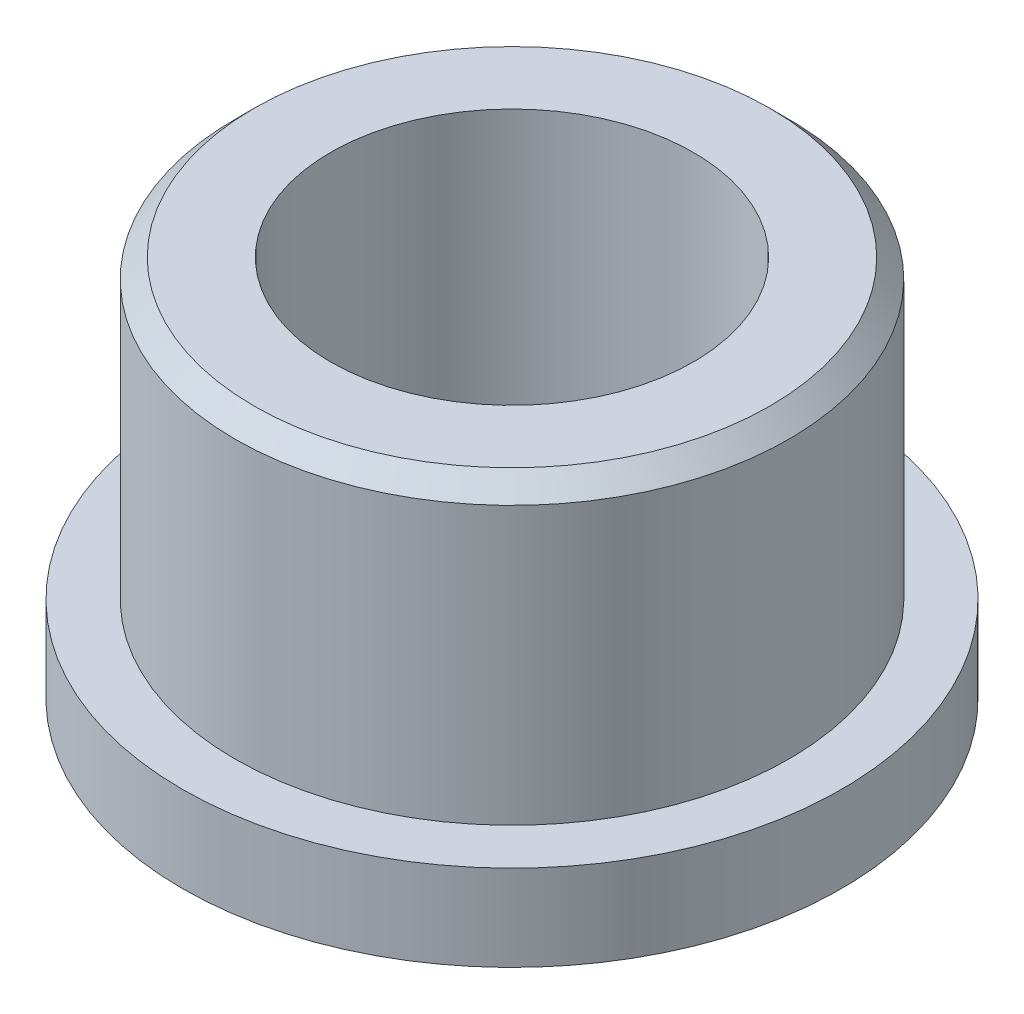
ISO-10303-21;
HEADER;
FILE_DESCRIPTION(('STEP AP214'),'2;1');
FILE_NAME('part.step','',(''),(''),'','','');
FILE_SCHEMA(('AUTOMOTIVE_DESIGN { 1 0 10303 214 1 1 1 1 }'));
ENDSEC;
DATA;
#1=APPLICATION_CONTEXT('core data for automotive mechanical design processes');
#2=APPLICATION_PROTOCOL_DEFINITION('international standard','automotive_design',2000,#1);
#3=PRODUCT_CONTEXT('',#1,'mechanical');
#4=PRODUCT('Part','Part','',(#3));
#5=PRODUCT_RELATED_PRODUCT_CATEGORY('part','',(#4));
#6=PRODUCT_DEFINITION_FORMATION('','',#4);
#7=PRODUCT_DEFINITION_CONTEXT('part definition',#1,'design');
#8=PRODUCT_DEFINITION('design','',#6,#7);
#9=PRODUCT_DEFINITION_SHAPE('','',#8);
#10=(LENGTH_UNIT() NAMED_UNIT(*) SI_UNIT(.MILLI.,.METRE.));
#11=(NAMED_UNIT(*) PLANE_ANGLE_UNIT() SI_UNIT($,.RADIAN.));
#12=(NAMED_UNIT(*) SI_UNIT($,.STERADIAN.) SOLID_ANGLE_UNIT());
#13=UNCERTAINTY_MEASURE_WITH_UNIT(LENGTH_MEASURE(1.E-05),#10,'distance_accuracy_value','');
#14=(GEOMETRIC_REPRESENTATION_CONTEXT(3) GLOBAL_UNCERTAINTY_ASSIGNED_CONTEXT((#13)) GLOBAL_UNIT_ASSIGNED_CONTEXT((#10,
#11,#12)) REPRESENTATION_CONTEXT('',''));
#15=CARTESIAN_POINT('',(0.,0.,0.));
#16=DIRECTION('',(0.,0.,1.));
#17=DIRECTION('',(1.,0.,0.));
#18=AXIS2_PLACEMENT_3D('',#15,#16,#17);
#19=CARTESIAN_POINT('',(0.,20.,0.));
#20=DIRECTION('',(0.,1.,0.));
#21=DIRECTION('',(0.,0.,1.));
#22=AXIS2_PLACEMENT_3D('',#19,#20,#21);
#23=PLANE('',#22);
#24=CARTESIAN_POINT('',(0.,20.,0.));
#25=DIRECTION('',(0.,1.,0.));
#26=DIRECTION('',(0.,0.,1.));
#27=AXIS2_PLACEMENT_3D('',#24,#25,#26);
#28=CIRCLE('',#27,13.5);
#29=CARTESIAN_POINT('',(0.,20.,13.5));
#30=VERTEX_POINT('',#29);
#31=EDGE_CURVE('E39',#30,#30,#28,.T.);
#32=ORIENTED_EDGE('',*,*,#31,.T.);
#33=EDGE_LOOP('',(#32));
#34=FACE_BOUND('',#33,.T.);
#35=CARTESIAN_POINT('',(0.,20.,0.));
#36=DIRECTION('',(0.,1.,0.));
#37=DIRECTION('',(0.,0.,1.));
#38=AXIS2_PLACEMENT_3D('',#35,#36,#37);
#39=CIRCLE('',#38,9.5);
#40=CARTESIAN_POINT('',(0.,20.,9.5));
#41=VERTEX_POINT('',#40);
#42=EDGE_CURVE('E47',#41,#41,#39,.T.);
#43=ORIENTED_EDGE('',*,*,#42,.F.);
#44=EDGE_LOOP('',(#43));
#45=FACE_BOUND('',#44,.T.);
#46=ADVANCED_FACE('F32',(#34,#45),#23,.T.);
#47=CARTESIAN_POINT('',(0.,20.,0.));
#48=DIRECTION('',(0.,-1.,0.));
#49=DIRECTION('',(0.,0.,-1.));
#50=AXIS2_PLACEMENT_3D('',#47,#48,#49);
#51=CYLINDRICAL_SURFACE('',#50,17.25);
#52=CARTESIAN_POINT('',(0.,0.,0.));
#53=DIRECTION('',(0.,1.,0.));
#54=DIRECTION('',(0.,0.,1.));
#55=AXIS2_PLACEMENT_3D('',#52,#53,#54);
#56=CIRCLE('',#55,17.25);
#57=CARTESIAN_POINT('',(0.,0.,17.25));
#58=VERTEX_POINT('',#57);
#59=EDGE_CURVE('E43',#58,#58,#56,.T.);
#60=ORIENTED_EDGE('',*,*,#59,.T.);
#61=EDGE_LOOP('',(#60));
#62=FACE_BOUND('',#61,.T.);
#63=CARTESIAN_POINT('',(0.,4.5,0.));
#64=DIRECTION('',(0.,1.,0.));
#65=DIRECTION('',(0.,0.,1.));
#66=AXIS2_PLACEMENT_3D('',#63,#64,#65);
#67=CIRCLE('',#66,17.25);
#68=CARTESIAN_POINT('',(0.,4.5,17.25));
#69=VERTEX_POINT('',#68);
#70=EDGE_CURVE('E58',#69,#69,#67,.F.);
#71=ORIENTED_EDGE('',*,*,#70,.T.);
#72=EDGE_LOOP('',(#71));
#73=FACE_BOUND('',#72,.T.);
#74=ADVANCED_FACE('F62',(#62,#73),#51,.T.);
#75=CARTESIAN_POINT('',(0.,0.,0.));
#76=DIRECTION('',(0.,1.,0.));
#77=DIRECTION('',(0.,0.,1.));
#78=AXIS2_PLACEMENT_3D('',#75,#76,#77);
#79=PLANE('',#78);
#80=ORIENTED_EDGE('',*,*,#59,.F.);
#81=EDGE_LOOP('',(#80));
#82=FACE_BOUND('',#81,.T.);
#83=CARTESIAN_POINT('',(0.,0.,0.));
#84=DIRECTION('',(0.,1.,0.));
#85=DIRECTION('',(0.,0.,1.));
#86=AXIS2_PLACEMENT_3D('',#83,#84,#85);
#87=CIRCLE('',#86,9.5);
#88=CARTESIAN_POINT('',(0.,0.,9.5));
#89=VERTEX_POINT('',#88);
#90=EDGE_CURVE('E50',#89,#89,#87,.T.);
#91=ORIENTED_EDGE('',*,*,#90,.T.);
#92=EDGE_LOOP('',(#91));
#93=FACE_BOUND('',#92,.T.);
#94=ADVANCED_FACE('F77',(#82,#93),#79,.F.);
#95=CARTESIAN_POINT('',(0.,20.,0.));
#96=DIRECTION('',(0.,-1.,0.));
#97=DIRECTION('',(0.,0.,-1.));
#98=AXIS2_PLACEMENT_3D('',#95,#96,#97);
#99=CYLINDRICAL_SURFACE('',#98,9.5);
#100=ORIENTED_EDGE('',*,*,#42,.T.);
#101=EDGE_LOOP('',(#100));
#102=FACE_BOUND('',#101,.T.);
#103=ORIENTED_EDGE('',*,*,#90,.F.);
#104=EDGE_LOOP('',(#103));
#105=FACE_BOUND('',#104,.T.);
#106=ADVANCED_FACE('F72',(#102,#105),#99,.F.);
#107=CARTESIAN_POINT('',(0.,-48.7903679018718,0.));
#108=DIRECTION('',(0.,1.,0.));
#109=DIRECTION('',(0.,0.,1.));
#110=AXIS2_PLACEMENT_3D('',#107,#108,#109);
#111=CYLINDRICAL_SURFACE('',#110,14.5);
#112=CARTESIAN_POINT('',(0.,19.,0.));
#113=DIRECTION('',(0.,1.,0.));
#114=DIRECTION('',(0.,0.,1.));
#115=AXIS2_PLACEMENT_3D('',#112,#113,#114);
#116=CIRCLE('',#115,14.5);
#117=CARTESIAN_POINT('',(0.,19.,14.5));
#118=VERTEX_POINT('',#117);
#119=EDGE_CURVE('E11',#118,#118,#116,.F.);
#120=ORIENTED_EDGE('',*,*,#119,.T.);
#121=EDGE_LOOP('',(#120));
#122=FACE_BOUND('',#121,.T.);
#123=CARTESIAN_POINT('',(0.,4.5,0.));
#124=DIRECTION('',(0.,1.,0.));
#125=DIRECTION('',(0.,0.,1.));
#126=AXIS2_PLACEMENT_3D('',#123,#124,#125);
#127=CIRCLE('',#126,14.5);
#128=CARTESIAN_POINT('',(0.,4.5,14.5));
#129=VERTEX_POINT('',#128);
#130=EDGE_CURVE('E53',#129,#129,#127,.F.);
#131=ORIENTED_EDGE('',*,*,#130,.F.);
#132=EDGE_LOOP('',(#131));
#133=FACE_BOUND('',#132,.T.);
#134=ADVANCED_FACE('F67',(#122,#133),#111,.T.);
#135=CARTESIAN_POINT('',(0.,4.5,0.));
#136=DIRECTION('',(0.,1.,0.));
#137=DIRECTION('',(0.,0.,1.));
#138=AXIS2_PLACEMENT_3D('',#135,#136,#137);
#139=PLANE('',#138);
#140=ORIENTED_EDGE('',*,*,#70,.F.);
#141=EDGE_LOOP('',(#140));
#142=FACE_BOUND('',#141,.T.);
#143=ORIENTED_EDGE('',*,*,#130,.T.);
#144=EDGE_LOOP('',(#143));
#145=FACE_BOUND('',#144,.T.);
#146=ADVANCED_FACE('F64',(#142,#145),#139,.T.);
#147=CARTESIAN_POINT('',(0.,20.,0.));
#148=DIRECTION('',(0.,-1.,0.));
#149=DIRECTION('',(0.,0.,-1.));
#150=AXIS2_PLACEMENT_3D('',#147,#148,#149);
#151=CONICAL_SURFACE('',#150,13.5,0.785398163397446);
#152=ORIENTED_EDGE('',*,*,#119,.F.);
#153=EDGE_LOOP('',(#152));
#154=FACE_BOUND('',#153,.T.);
#155=ORIENTED_EDGE('',*,*,#31,.F.);
#156=EDGE_LOOP('',(#155));
#157=FACE_BOUND('',#156,.T.);
#158=ADVANCED_FACE('F34',(#154,#157),#151,.T.);
#159=CLOSED_SHELL('',(#46,#74,#94,#106,#134,#146,#158));
#160=MANIFOLD_SOLID_BREP('B2',#159);
#161=ADVANCED_BREP_SHAPE_REPRESENTATION('',(#18,#160),#14);
#162=SHAPE_DEFINITION_REPRESENTATION(#9,#161);
ENDSEC;
END-ISO-10303-21;
